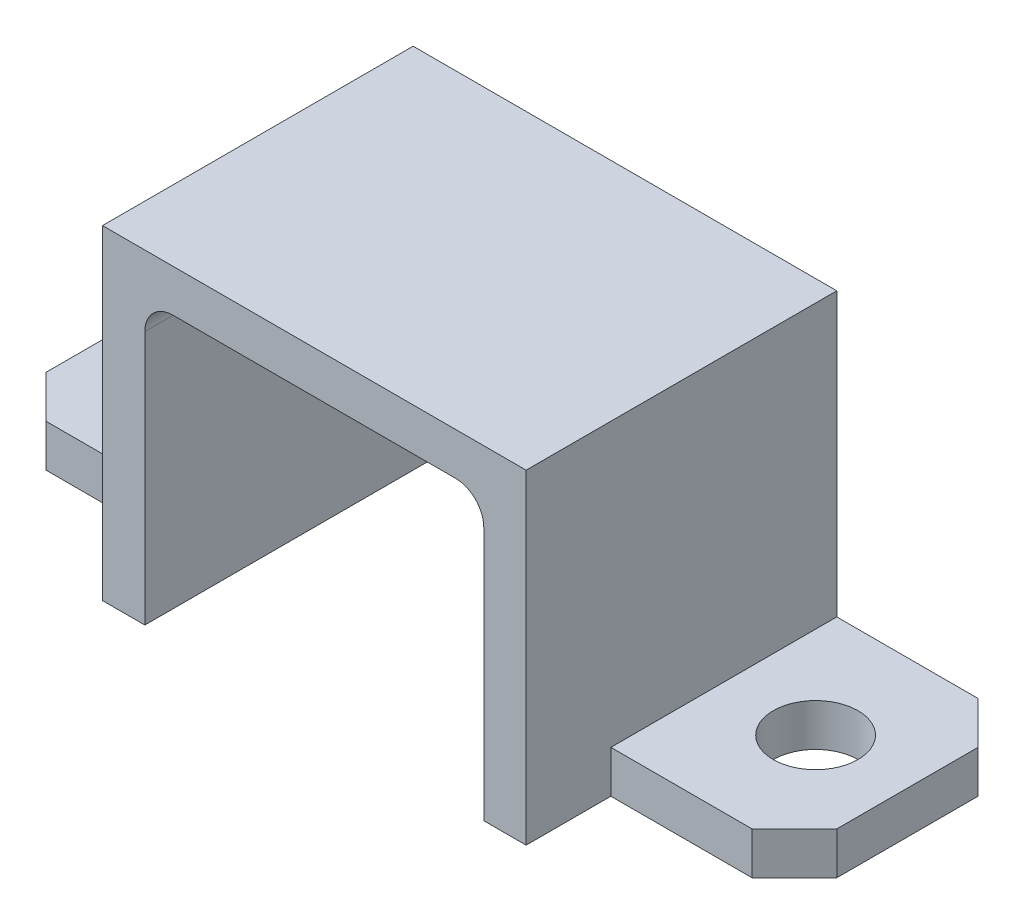
ISO-10303-21;
HEADER;
FILE_DESCRIPTION(('STEP AP214'),'2;1');
FILE_NAME('part.step','',(''),(''),'','','');
FILE_SCHEMA(('AUTOMOTIVE_DESIGN { 1 0 10303 214 1 1 1 1 }'));
ENDSEC;
DATA;
#1=APPLICATION_CONTEXT('core data for automotive mechanical design processes');
#2=APPLICATION_PROTOCOL_DEFINITION('international standard','automotive_design',2000,#1);
#3=PRODUCT_CONTEXT('',#1,'mechanical');
#4=PRODUCT('Part','Part','',(#3));
#5=PRODUCT_RELATED_PRODUCT_CATEGORY('part','',(#4));
#6=PRODUCT_DEFINITION_FORMATION('','',#4);
#7=PRODUCT_DEFINITION_CONTEXT('part definition',#1,'design');
#8=PRODUCT_DEFINITION('design','',#6,#7);
#9=PRODUCT_DEFINITION_SHAPE('','',#8);
#10=(LENGTH_UNIT() NAMED_UNIT(*) SI_UNIT(.MILLI.,.METRE.));
#11=(NAMED_UNIT(*) PLANE_ANGLE_UNIT() SI_UNIT($,.RADIAN.));
#12=(NAMED_UNIT(*) SI_UNIT($,.STERADIAN.) SOLID_ANGLE_UNIT());
#13=UNCERTAINTY_MEASURE_WITH_UNIT(LENGTH_MEASURE(1.E-05),#10,'distance_accuracy_value','');
#14=(GEOMETRIC_REPRESENTATION_CONTEXT(3) GLOBAL_UNCERTAINTY_ASSIGNED_CONTEXT((#13)) GLOBAL_UNIT_ASSIGNED_CONTEXT((#10,
#11,#12)) REPRESENTATION_CONTEXT('',''));
#15=CARTESIAN_POINT('',(0.,0.,0.));
#16=DIRECTION('',(0.,0.,1.));
#17=DIRECTION('',(1.,0.,0.));
#18=AXIS2_PLACEMENT_3D('',#15,#16,#17);
#19=CARTESIAN_POINT('',(22.,0.,11.));
#20=DIRECTION('',(-1.,0.,0.));
#21=DIRECTION('',(0.,0.,1.));
#22=AXIS2_PLACEMENT_3D('',#19,#20,#21);
#23=PLANE('',#22);
#24=DIRECTION('',(0.,0.,-1.));
#25=VECTOR('',#24,1.);
#26=CARTESIAN_POINT('',(22.,0.,11.));
#27=LINE('',#26,#25);
#28=CARTESIAN_POINT('',(22.,0.,6.5));
#29=VERTEX_POINT('',#28);
#30=CARTESIAN_POINT('',(22.,0.,1.5));
#31=VERTEX_POINT('',#30);
#32=EDGE_CURVE('E220',#29,#31,#27,.T.);
#33=ORIENTED_EDGE('',*,*,#32,.T.);
#34=DIRECTION('',(0.,1.,0.));
#35=VECTOR('',#34,1.);
#36=CARTESIAN_POINT('',(22.,0.,1.5));
#37=LINE('',#36,#35);
#38=CARTESIAN_POINT('',(22.,1.5,1.5));
#39=VERTEX_POINT('',#38);
#40=EDGE_CURVE('E359',#31,#39,#37,.T.);
#41=ORIENTED_EDGE('',*,*,#40,.T.);
#42=DIRECTION('',(0.,0.,-1.));
#43=VECTOR('',#42,1.);
#44=CARTESIAN_POINT('',(22.,1.5,11.));
#45=LINE('',#44,#43);
#46=CARTESIAN_POINT('',(22.,1.5,6.5));
#47=VERTEX_POINT('',#46);
#48=EDGE_CURVE('E217',#47,#39,#45,.T.);
#49=ORIENTED_EDGE('',*,*,#48,.F.);
#50=DIRECTION('',(0.,1.,0.));
#51=VECTOR('',#50,1.);
#52=CARTESIAN_POINT('',(22.,0.,6.5));
#53=LINE('',#52,#51);
#54=EDGE_CURVE('E349',#29,#47,#53,.T.);
#55=ORIENTED_EDGE('',*,*,#54,.F.);
#56=EDGE_LOOP('',(#33,#41,#49,#55));
#57=FACE_BOUND('',#56,.T.);
#58=ADVANCED_FACE('F36',(#57),#23,.F.);
#59=CARTESIAN_POINT('',(22.,1.5,11.));
#60=DIRECTION('',(0.,-1.,0.));
#61=DIRECTION('',(1.,0.,0.));
#62=AXIS2_PLACEMENT_3D('',#59,#60,#61);
#63=PLANE('',#62);
#64=CARTESIAN_POINT('',(18.75,1.5,4.));
#65=DIRECTION('',(0.,1.,0.));
#66=DIRECTION('',(1.,0.,0.));
#67=AXIS2_PLACEMENT_3D('',#64,#65,#66);
#68=CIRCLE('',#67,1.5);
#69=CARTESIAN_POINT('',(20.25,1.5,4.));
#70=VERTEX_POINT('',#69);
#71=EDGE_CURVE('E369',#70,#70,#68,.T.);
#72=ORIENTED_EDGE('',*,*,#71,.F.);
#73=EDGE_LOOP('',(#72));
#74=FACE_BOUND('',#73,.T.);
#75=ORIENTED_EDGE('',*,*,#48,.T.);
#76=DIRECTION('',(0.707106781186547,0.,0.707106781186548));
#77=VECTOR('',#76,1.);
#78=CARTESIAN_POINT('',(22.,1.5,1.5));
#79=LINE('',#78,#77);
#80=CARTESIAN_POINT('',(20.5,1.5,0.));
#81=VERTEX_POINT('',#80);
#82=EDGE_CURVE('E354',#81,#39,#79,.T.);
#83=ORIENTED_EDGE('',*,*,#82,.F.);
#84=DIRECTION('',(-1.,0.,0.));
#85=VECTOR('',#84,1.);
#86=CARTESIAN_POINT('',(22.,1.5,0.));
#87=LINE('',#86,#85);
#88=CARTESIAN_POINT('',(15.5,1.5,0.));
#89=VERTEX_POINT('',#88);
#90=EDGE_CURVE('E240',#81,#89,#87,.T.);
#91=ORIENTED_EDGE('',*,*,#90,.T.);
#92=DIRECTION('',(0.,0.,-1.));
#93=VECTOR('',#92,1.);
#94=CARTESIAN_POINT('',(15.5,1.5,11.));
#95=LINE('',#94,#93);
#96=CARTESIAN_POINT('',(15.5,1.5,8.));
#97=VERTEX_POINT('',#96);
#98=EDGE_CURVE('E214',#97,#89,#95,.T.);
#99=ORIENTED_EDGE('',*,*,#98,.F.);
#100=DIRECTION('',(-1.,0.,0.));
#101=VECTOR('',#100,1.);
#102=CARTESIAN_POINT('',(15.5,1.5,8.));
#103=LINE('',#102,#101);
#104=CARTESIAN_POINT('',(20.5,1.5,8.));
#105=VERTEX_POINT('',#104);
#106=EDGE_CURVE('E331',#105,#97,#103,.T.);
#107=ORIENTED_EDGE('',*,*,#106,.F.);
#108=DIRECTION('',(-0.707106781186547,0.,0.707106781186548));
#109=VECTOR('',#108,1.);
#110=CARTESIAN_POINT('',(22.,1.5,6.5));
#111=LINE('',#110,#109);
#112=EDGE_CURVE('E355',#47,#105,#111,.T.);
#113=ORIENTED_EDGE('',*,*,#112,.F.);
#114=EDGE_LOOP('',(#75,#83,#91,#99,#107,#113));
#115=FACE_BOUND('',#114,.T.);
#116=ADVANCED_FACE('F393',(#74,#115),#63,.F.);
#117=CARTESIAN_POINT('',(13.,9.,11.));
#118=DIRECTION('',(0.,0.,-1.));
#119=DIRECTION('',(-1.,0.,0.));
#120=AXIS2_PLACEMENT_3D('',#117,#118,#119);
#121=CYLINDRICAL_SURFACE('',#120,1.);
#122=CARTESIAN_POINT('',(13.,9.,0.));
#123=DIRECTION('',(0.,0.,-1.));
#124=DIRECTION('',(-1.,0.,0.));
#125=AXIS2_PLACEMENT_3D('',#122,#123,#124);
#126=CIRCLE('',#125,1.);
#127=CARTESIAN_POINT('',(13.,10.,0.));
#128=VERTEX_POINT('',#127);
#129=CARTESIAN_POINT('',(14.,9.,0.));
#130=VERTEX_POINT('',#129);
#131=EDGE_CURVE('E244',#128,#130,#126,.T.);
#132=ORIENTED_EDGE('',*,*,#131,.T.);
#133=DIRECTION('',(0.,0.,-1.));
#134=VECTOR('',#133,1.);
#135=CARTESIAN_POINT('',(14.,9.,11.));
#136=LINE('',#135,#134);
#137=CARTESIAN_POINT('',(14.,9.,11.));
#138=VERTEX_POINT('',#137);
#139=EDGE_CURVE('E11',#138,#130,#136,.T.);
#140=ORIENTED_EDGE('',*,*,#139,.F.);
#141=CARTESIAN_POINT('',(13.,9.,11.));
#142=DIRECTION('',(0.,0.,-1.));
#143=DIRECTION('',(-1.,0.,0.));
#144=AXIS2_PLACEMENT_3D('',#141,#142,#143);
#145=CIRCLE('',#144,1.);
#146=CARTESIAN_POINT('',(13.,10.,11.));
#147=VERTEX_POINT('',#146);
#148=EDGE_CURVE('E265',#147,#138,#145,.T.);
#149=ORIENTED_EDGE('',*,*,#148,.F.);
#150=DIRECTION('',(0.,0.,-1.));
#151=VECTOR('',#150,1.);
#152=CARTESIAN_POINT('',(13.,10.,11.));
#153=LINE('',#152,#151);
#154=EDGE_CURVE('E266',#147,#128,#153,.T.);
#155=ORIENTED_EDGE('',*,*,#154,.T.);
#156=EDGE_LOOP('',(#132,#140,#149,#155));
#157=FACE_BOUND('',#156,.T.);
#158=ADVANCED_FACE('F38',(#157),#121,.F.);
#159=CARTESIAN_POINT('',(14.,9.,11.));
#160=DIRECTION('',(1.,0.,0.));
#161=DIRECTION('',(0.,0.,-1.));
#162=AXIS2_PLACEMENT_3D('',#159,#160,#161);
#163=PLANE('',#162);
#164=DIRECTION('',(0.,-1.,0.));
#165=VECTOR('',#164,1.);
#166=CARTESIAN_POINT('',(14.,9.,0.));
#167=LINE('',#166,#165);
#168=CARTESIAN_POINT('',(14.,0.,0.));
#169=VERTEX_POINT('',#168);
#170=EDGE_CURVE('E237',#130,#169,#167,.T.);
#171=ORIENTED_EDGE('',*,*,#170,.T.);
#172=DIRECTION('',(0.,0.,-1.));
#173=VECTOR('',#172,1.);
#174=CARTESIAN_POINT('',(14.,0.,11.));
#175=LINE('',#174,#173);
#176=CARTESIAN_POINT('',(14.,0.,11.));
#177=VERTEX_POINT('',#176);
#178=EDGE_CURVE('E44',#177,#169,#175,.T.);
#179=ORIENTED_EDGE('',*,*,#178,.F.);
#180=DIRECTION('',(0.,-1.,0.));
#181=VECTOR('',#180,1.);
#182=CARTESIAN_POINT('',(14.,9.,11.));
#183=LINE('',#182,#181);
#184=EDGE_CURVE('E295',#138,#177,#183,.T.);
#185=ORIENTED_EDGE('',*,*,#184,.F.);
#186=ORIENTED_EDGE('',*,*,#139,.T.);
#187=EDGE_LOOP('',(#171,#179,#185,#186));
#188=FACE_BOUND('',#187,.T.);
#189=ADVANCED_FACE('F405',(#188),#163,.F.);
#190=CARTESIAN_POINT('',(14.,0.,11.));
#191=DIRECTION('',(0.,1.,0.));
#192=DIRECTION('',(-1.,0.,0.));
#193=AXIS2_PLACEMENT_3D('',#190,#191,#192);
#194=PLANE('',#193);
#195=CARTESIAN_POINT('',(18.75,0.,4.));
#196=DIRECTION('',(0.,1.,0.));
#197=DIRECTION('',(1.,0.,0.));
#198=AXIS2_PLACEMENT_3D('',#195,#196,#197);
#199=CIRCLE('',#198,1.5);
#200=CARTESIAN_POINT('',(20.25,0.,4.));
#201=VERTEX_POINT('',#200);
#202=EDGE_CURVE('E346',#201,#201,#199,.T.);
#203=ORIENTED_EDGE('',*,*,#202,.T.);
#204=EDGE_LOOP('',(#203));
#205=FACE_BOUND('',#204,.T.);
#206=DIRECTION('',(1.,0.,0.));
#207=VECTOR('',#206,1.);
#208=CARTESIAN_POINT('',(14.,0.,0.));
#209=LINE('',#208,#207);
#210=CARTESIAN_POINT('',(20.5,0.,0.));
#211=VERTEX_POINT('',#210);
#212=EDGE_CURVE('E229',#169,#211,#209,.T.);
#213=ORIENTED_EDGE('',*,*,#212,.T.);
#214=DIRECTION('',(0.707106781186547,0.,0.707106781186548));
#215=VECTOR('',#214,1.);
#216=CARTESIAN_POINT('',(22.,0.,1.5));
#217=LINE('',#216,#215);
#218=EDGE_CURVE('E51',#211,#31,#217,.T.);
#219=ORIENTED_EDGE('',*,*,#218,.T.);
#220=ORIENTED_EDGE('',*,*,#32,.F.);
#221=DIRECTION('',(-0.707106781186547,0.,0.707106781186548));
#222=VECTOR('',#221,1.);
#223=CARTESIAN_POINT('',(22.,0.,6.5));
#224=LINE('',#223,#222);
#225=CARTESIAN_POINT('',(20.5,0.,8.));
#226=VERTEX_POINT('',#225);
#227=EDGE_CURVE('E352',#29,#226,#224,.T.);
#228=ORIENTED_EDGE('',*,*,#227,.T.);
#229=DIRECTION('',(1.,0.,0.));
#230=VECTOR('',#229,1.);
#231=CARTESIAN_POINT('',(15.5,0.,8.));
#232=LINE('',#231,#230);
#233=CARTESIAN_POINT('',(15.5,0.,8.));
#234=VERTEX_POINT('',#233);
#235=EDGE_CURVE('E328',#234,#226,#232,.T.);
#236=ORIENTED_EDGE('',*,*,#235,.F.);
#237=DIRECTION('',(0.,0.,1.));
#238=VECTOR('',#237,1.);
#239=CARTESIAN_POINT('',(15.5,0.,8.));
#240=LINE('',#239,#238);
#241=CARTESIAN_POINT('',(15.5,0.,11.));
#242=VERTEX_POINT('',#241);
#243=EDGE_CURVE('E299',#234,#242,#240,.T.);
#244=ORIENTED_EDGE('',*,*,#243,.T.);
#245=DIRECTION('',(1.,0.,0.));
#246=VECTOR('',#245,1.);
#247=CARTESIAN_POINT('',(14.,0.,11.));
#248=LINE('',#247,#246);
#249=EDGE_CURVE('E232',#177,#242,#248,.T.);
#250=ORIENTED_EDGE('',*,*,#249,.F.);
#251=ORIENTED_EDGE('',*,*,#178,.T.);
#252=EDGE_LOOP('',(#213,#219,#220,#228,#236,#244,#250,#251));
#253=FACE_BOUND('',#252,.T.);
#254=ADVANCED_FACE('F228',(#205,#253),#194,.F.);
#255=CARTESIAN_POINT('',(15.5,11.5,11.));
#256=DIRECTION('',(-1.,0.,0.));
#257=DIRECTION('',(0.,-1.,0.));
#258=AXIS2_PLACEMENT_3D('',#255,#256,#257);
#259=PLANE('',#258);
#260=DIRECTION('',(0.,1.,0.));
#261=VECTOR('',#260,1.);
#262=CARTESIAN_POINT('',(15.5,11.5,0.));
#263=LINE('',#262,#261);
#264=CARTESIAN_POINT('',(15.5,11.5,0.));
#265=VERTEX_POINT('',#264);
#266=EDGE_CURVE('E242',#89,#265,#263,.T.);
#267=ORIENTED_EDGE('',*,*,#266,.T.);
#268=DIRECTION('',(0.,0.,-1.));
#269=VECTOR('',#268,1.);
#270=CARTESIAN_POINT('',(15.5,11.5,11.));
#271=LINE('',#270,#269);
#272=CARTESIAN_POINT('',(15.5,11.5,11.));
#273=VERTEX_POINT('',#272);
#274=EDGE_CURVE('E211',#273,#265,#271,.T.);
#275=ORIENTED_EDGE('',*,*,#274,.F.);
#276=DIRECTION('',(0.,1.,0.));
#277=VECTOR('',#276,1.);
#278=CARTESIAN_POINT('',(15.5,11.5,11.));
#279=LINE('',#278,#277);
#280=EDGE_CURVE('E303',#242,#273,#279,.T.);
#281=ORIENTED_EDGE('',*,*,#280,.F.);
#282=ORIENTED_EDGE('',*,*,#243,.F.);
#283=DIRECTION('',(0.,-1.,0.));
#284=VECTOR('',#283,1.);
#285=CARTESIAN_POINT('',(15.5,1.5,8.));
#286=LINE('',#285,#284);
#287=EDGE_CURVE('E325',#97,#234,#286,.T.);
#288=ORIENTED_EDGE('',*,*,#287,.F.);
#289=ORIENTED_EDGE('',*,*,#98,.T.);
#290=EDGE_LOOP('',(#267,#275,#281,#282,#288,#289));
#291=FACE_BOUND('',#290,.T.);
#292=ADVANCED_FACE('F404',(#291),#259,.F.);
#293=CARTESIAN_POINT('',(0.5,11.5,11.));
#294=DIRECTION('',(0.,-1.,0.));
#295=DIRECTION('',(0.,0.,-1.));
#296=AXIS2_PLACEMENT_3D('',#293,#294,#295);
#297=PLANE('',#296);
#298=DIRECTION('',(-1.,0.,0.));
#299=VECTOR('',#298,1.);
#300=CARTESIAN_POINT('',(0.5,11.5,0.));
#301=LINE('',#300,#299);
#302=CARTESIAN_POINT('',(0.5,11.5,0.));
#303=VERTEX_POINT('',#302);
#304=EDGE_CURVE('E249',#265,#303,#301,.T.);
#305=ORIENTED_EDGE('',*,*,#304,.T.);
#306=DIRECTION('',(0.,0.,-1.));
#307=VECTOR('',#306,1.);
#308=CARTESIAN_POINT('',(0.5,11.5,11.));
#309=LINE('',#308,#307);
#310=CARTESIAN_POINT('',(0.5,11.5,11.));
#311=VERTEX_POINT('',#310);
#312=EDGE_CURVE('E208',#311,#303,#309,.T.);
#313=ORIENTED_EDGE('',*,*,#312,.F.);
#314=DIRECTION('',(-1.,0.,0.));
#315=VECTOR('',#314,1.);
#316=CARTESIAN_POINT('',(0.5,11.5,11.));
#317=LINE('',#316,#315);
#318=EDGE_CURVE('E305',#273,#311,#317,.T.);
#319=ORIENTED_EDGE('',*,*,#318,.F.);
#320=ORIENTED_EDGE('',*,*,#274,.T.);
#321=EDGE_LOOP('',(#305,#313,#319,#320));
#322=FACE_BOUND('',#321,.T.);
#323=ADVANCED_FACE('F419',(#322),#297,.F.);
#324=CARTESIAN_POINT('',(0.5,1.5,11.));
#325=DIRECTION('',(1.,0.,0.));
#326=DIRECTION('',(0.,0.,-1.));
#327=AXIS2_PLACEMENT_3D('',#324,#325,#326);
#328=PLANE('',#327);
#329=DIRECTION('',(0.,-1.,0.));
#330=VECTOR('',#329,1.);
#331=CARTESIAN_POINT('',(0.5,1.5,0.));
#332=LINE('',#331,#330);
#333=CARTESIAN_POINT('',(0.5,1.5,0.));
#334=VERTEX_POINT('',#333);
#335=EDGE_CURVE('E251',#303,#334,#332,.T.);
#336=ORIENTED_EDGE('',*,*,#335,.T.);
#337=DIRECTION('',(0.,0.,-1.));
#338=VECTOR('',#337,1.);
#339=CARTESIAN_POINT('',(0.5,1.5,11.));
#340=LINE('',#339,#338);
#341=CARTESIAN_POINT('',(0.5,1.5,8.));
#342=VERTEX_POINT('',#341);
#343=EDGE_CURVE('E200',#342,#334,#340,.T.);
#344=ORIENTED_EDGE('',*,*,#343,.F.);
#345=DIRECTION('',(0.,1.,0.));
#346=VECTOR('',#345,1.);
#347=CARTESIAN_POINT('',(0.5,1.5,8.));
#348=LINE('',#347,#346);
#349=CARTESIAN_POINT('',(0.5,0.,8.));
#350=VERTEX_POINT('',#349);
#351=EDGE_CURVE('E336',#350,#342,#348,.T.);
#352=ORIENTED_EDGE('',*,*,#351,.F.);
#353=DIRECTION('',(0.,0.,1.));
#354=VECTOR('',#353,1.);
#355=CARTESIAN_POINT('',(0.5,0.,8.));
#356=LINE('',#355,#354);
#357=CARTESIAN_POINT('',(0.5,0.,11.));
#358=VERTEX_POINT('',#357);
#359=EDGE_CURVE('E314',#350,#358,#356,.T.);
#360=ORIENTED_EDGE('',*,*,#359,.T.);
#361=DIRECTION('',(0.,-1.,0.));
#362=VECTOR('',#361,1.);
#363=CARTESIAN_POINT('',(0.5,1.5,11.));
#364=LINE('',#363,#362);
#365=EDGE_CURVE('E307',#311,#358,#364,.T.);
#366=ORIENTED_EDGE('',*,*,#365,.F.);
#367=ORIENTED_EDGE('',*,*,#312,.T.);
#368=EDGE_LOOP('',(#336,#344,#352,#360,#366,#367));
#369=FACE_BOUND('',#368,.T.);
#370=ADVANCED_FACE('F421',(#369),#328,.F.);
#371=CARTESIAN_POINT('',(-6.,1.5,11.));
#372=DIRECTION('',(0.,-1.,0.));
#373=DIRECTION('',(1.,0.,0.));
#374=AXIS2_PLACEMENT_3D('',#371,#372,#373);
#375=PLANE('',#374);
#376=CARTESIAN_POINT('',(-2.75,1.5,4.));
#377=DIRECTION('',(0.,1.,0.));
#378=DIRECTION('',(-1.,0.,0.));
#379=AXIS2_PLACEMENT_3D('',#376,#377,#378);
#380=CIRCLE('',#379,1.5);
#381=CARTESIAN_POINT('',(-4.25,1.5,4.));
#382=VERTEX_POINT('',#381);
#383=EDGE_CURVE('E343',#382,#382,#380,.T.);
#384=ORIENTED_EDGE('',*,*,#383,.F.);
#385=EDGE_LOOP('',(#384));
#386=FACE_BOUND('',#385,.T.);
#387=DIRECTION('',(-1.,0.,0.));
#388=VECTOR('',#387,1.);
#389=CARTESIAN_POINT('',(-6.,1.5,0.));
#390=LINE('',#389,#388);
#391=CARTESIAN_POINT('',(-4.5,1.5,0.));
#392=VERTEX_POINT('',#391);
#393=EDGE_CURVE('E254',#334,#392,#390,.T.);
#394=ORIENTED_EDGE('',*,*,#393,.T.);
#395=DIRECTION('',(0.707106781186547,0.,-0.707106781186548));
#396=VECTOR('',#395,1.);
#397=CARTESIAN_POINT('',(-6.,1.5,1.5));
#398=LINE('',#397,#396);
#399=CARTESIAN_POINT('',(-6.,1.5,1.5));
#400=VERTEX_POINT('',#399);
#401=EDGE_CURVE('E59',#400,#392,#398,.T.);
#402=ORIENTED_EDGE('',*,*,#401,.F.);
#403=DIRECTION('',(0.,0.,-1.));
#404=VECTOR('',#403,1.);
#405=CARTESIAN_POINT('',(-6.,1.5,11.));
#406=LINE('',#405,#404);
#407=CARTESIAN_POINT('',(-6.,1.5,6.5));
#408=VERTEX_POINT('',#407);
#409=EDGE_CURVE('E197',#408,#400,#406,.T.);
#410=ORIENTED_EDGE('',*,*,#409,.F.);
#411=DIRECTION('',(-0.707106781186548,0.,-0.707106781186548));
#412=VECTOR('',#411,1.);
#413=CARTESIAN_POINT('',(-6.,1.5,6.5));
#414=LINE('',#413,#412);
#415=CARTESIAN_POINT('',(-4.5,1.5,8.));
#416=VERTEX_POINT('',#415);
#417=EDGE_CURVE('E178',#416,#408,#414,.T.);
#418=ORIENTED_EDGE('',*,*,#417,.F.);
#419=DIRECTION('',(-1.,0.,0.));
#420=VECTOR('',#419,1.);
#421=CARTESIAN_POINT('',(0.5,1.5,8.));
#422=LINE('',#421,#420);
#423=EDGE_CURVE('E321',#342,#416,#422,.T.);
#424=ORIENTED_EDGE('',*,*,#423,.F.);
#425=ORIENTED_EDGE('',*,*,#343,.T.);
#426=EDGE_LOOP('',(#394,#402,#410,#418,#424,#425));
#427=FACE_BOUND('',#426,.T.);
#428=ADVANCED_FACE('F378',(#386,#427),#375,.F.);
#429=CARTESIAN_POINT('',(-6.,0.,11.));
#430=DIRECTION('',(1.,0.,0.));
#431=DIRECTION('',(0.,0.,-1.));
#432=AXIS2_PLACEMENT_3D('',#429,#430,#431);
#433=PLANE('',#432);
#434=ORIENTED_EDGE('',*,*,#409,.T.);
#435=DIRECTION('',(0.,1.,0.));
#436=VECTOR('',#435,1.);
#437=CARTESIAN_POINT('',(-6.,0.,1.5));
#438=LINE('',#437,#436);
#439=CARTESIAN_POINT('',(-6.,0.,1.5));
#440=VERTEX_POINT('',#439);
#441=EDGE_CURVE('E196',#440,#400,#438,.T.);
#442=ORIENTED_EDGE('',*,*,#441,.F.);
#443=DIRECTION('',(0.,0.,-1.));
#444=VECTOR('',#443,1.);
#445=CARTESIAN_POINT('',(-6.,0.,11.));
#446=LINE('',#445,#444);
#447=CARTESIAN_POINT('',(-6.,0.,6.5));
#448=VERTEX_POINT('',#447);
#449=EDGE_CURVE('E190',#448,#440,#446,.T.);
#450=ORIENTED_EDGE('',*,*,#449,.F.);
#451=DIRECTION('',(0.,1.,0.));
#452=VECTOR('',#451,1.);
#453=CARTESIAN_POINT('',(-6.,0.,6.5));
#454=LINE('',#453,#452);
#455=EDGE_CURVE('E172',#448,#408,#454,.T.);
#456=ORIENTED_EDGE('',*,*,#455,.T.);
#457=EDGE_LOOP('',(#434,#442,#450,#456));
#458=FACE_BOUND('',#457,.T.);
#459=ADVANCED_FACE('F195',(#458),#433,.F.);
#460=CARTESIAN_POINT('',(2.,0.,11.));
#461=DIRECTION('',(0.,1.,0.));
#462=DIRECTION('',(-1.,0.,0.));
#463=AXIS2_PLACEMENT_3D('',#460,#461,#462);
#464=PLANE('',#463);
#465=CARTESIAN_POINT('',(-2.75,0.,4.));
#466=DIRECTION('',(0.,1.,0.));
#467=DIRECTION('',(-1.,0.,0.));
#468=AXIS2_PLACEMENT_3D('',#465,#466,#467);
#469=CIRCLE('',#468,1.5);
#470=CARTESIAN_POINT('',(-4.25,0.,4.));
#471=VERTEX_POINT('',#470);
#472=EDGE_CURVE('E329',#471,#471,#469,.T.);
#473=ORIENTED_EDGE('',*,*,#472,.T.);
#474=EDGE_LOOP('',(#473));
#475=FACE_BOUND('',#474,.T.);
#476=ORIENTED_EDGE('',*,*,#449,.T.);
#477=DIRECTION('',(0.707106781186547,0.,-0.707106781186548));
#478=VECTOR('',#477,1.);
#479=CARTESIAN_POINT('',(-6.,0.,1.5));
#480=LINE('',#479,#478);
#481=CARTESIAN_POINT('',(-4.5,0.,0.));
#482=VERTEX_POINT('',#481);
#483=EDGE_CURVE('E367',#440,#482,#480,.T.);
#484=ORIENTED_EDGE('',*,*,#483,.T.);
#485=DIRECTION('',(1.,0.,0.));
#486=VECTOR('',#485,1.);
#487=CARTESIAN_POINT('',(2.,0.,0.));
#488=LINE('',#487,#486);
#489=CARTESIAN_POINT('',(2.,0.,0.));
#490=VERTEX_POINT('',#489);
#491=EDGE_CURVE('E257',#482,#490,#488,.T.);
#492=ORIENTED_EDGE('',*,*,#491,.T.);
#493=DIRECTION('',(0.,0.,-1.));
#494=VECTOR('',#493,1.);
#495=CARTESIAN_POINT('',(2.,0.,11.));
#496=LINE('',#495,#494);
#497=CARTESIAN_POINT('',(2.,0.,11.));
#498=VERTEX_POINT('',#497);
#499=EDGE_CURVE('E198',#498,#490,#496,.T.);
#500=ORIENTED_EDGE('',*,*,#499,.F.);
#501=DIRECTION('',(1.,0.,0.));
#502=VECTOR('',#501,1.);
#503=CARTESIAN_POINT('',(2.,0.,11.));
#504=LINE('',#503,#502);
#505=EDGE_CURVE('E309',#358,#498,#504,.T.);
#506=ORIENTED_EDGE('',*,*,#505,.F.);
#507=ORIENTED_EDGE('',*,*,#359,.F.);
#508=DIRECTION('',(1.,0.,0.));
#509=VECTOR('',#508,1.);
#510=CARTESIAN_POINT('',(0.5,0.,8.));
#511=LINE('',#510,#509);
#512=CARTESIAN_POINT('',(-4.5,0.,8.));
#513=VERTEX_POINT('',#512);
#514=EDGE_CURVE('E192',#513,#350,#511,.T.);
#515=ORIENTED_EDGE('',*,*,#514,.F.);
#516=DIRECTION('',(-0.707106781186548,0.,-0.707106781186548));
#517=VECTOR('',#516,1.);
#518=CARTESIAN_POINT('',(-6.,0.,6.5));
#519=LINE('',#518,#517);
#520=EDGE_CURVE('E175',#513,#448,#519,.T.);
#521=ORIENTED_EDGE('',*,*,#520,.T.);
#522=EDGE_LOOP('',(#476,#484,#492,#500,#506,#507,#515,#521));
#523=FACE_BOUND('',#522,.T.);
#524=ADVANCED_FACE('F188',(#475,#523),#464,.F.);
#525=CARTESIAN_POINT('',(2.,0.,11.));
#526=DIRECTION('',(-1.,0.,0.));
#527=DIRECTION('',(0.,0.,1.));
#528=AXIS2_PLACEMENT_3D('',#525,#526,#527);
#529=PLANE('',#528);
#530=DIRECTION('',(0.,1.,0.));
#531=VECTOR('',#530,1.);
#532=CARTESIAN_POINT('',(2.,0.,0.));
#533=LINE('',#532,#531);
#534=CARTESIAN_POINT('',(2.,9.,0.));
#535=VERTEX_POINT('',#534);
#536=EDGE_CURVE('E259',#490,#535,#533,.T.);
#537=ORIENTED_EDGE('',*,*,#536,.T.);
#538=DIRECTION('',(0.,0.,-1.));
#539=VECTOR('',#538,1.);
#540=CARTESIAN_POINT('',(2.,9.,11.));
#541=LINE('',#540,#539);
#542=CARTESIAN_POINT('',(2.,9.,11.));
#543=VERTEX_POINT('',#542);
#544=EDGE_CURVE('E203',#543,#535,#541,.T.);
#545=ORIENTED_EDGE('',*,*,#544,.F.);
#546=DIRECTION('',(0.,1.,0.));
#547=VECTOR('',#546,1.);
#548=CARTESIAN_POINT('',(2.,0.,11.));
#549=LINE('',#548,#547);
#550=EDGE_CURVE('E311',#498,#543,#549,.T.);
#551=ORIENTED_EDGE('',*,*,#550,.F.);
#552=ORIENTED_EDGE('',*,*,#499,.T.);
#553=EDGE_LOOP('',(#537,#545,#551,#552));
#554=FACE_BOUND('',#553,.T.);
#555=ADVANCED_FACE('F423',(#554),#529,.F.);
#556=CARTESIAN_POINT('',(3.,9.,11.));
#557=DIRECTION('',(0.,0.,-1.));
#558=DIRECTION('',(-1.,0.,0.));
#559=AXIS2_PLACEMENT_3D('',#556,#557,#558);
#560=CYLINDRICAL_SURFACE('',#559,1.);
#561=CARTESIAN_POINT('',(3.,9.,0.));
#562=DIRECTION('',(0.,0.,-1.));
#563=DIRECTION('',(-1.,0.,0.));
#564=AXIS2_PLACEMENT_3D('',#561,#562,#563);
#565=CIRCLE('',#564,1.);
#566=CARTESIAN_POINT('',(3.,10.,0.));
#567=VERTEX_POINT('',#566);
#568=EDGE_CURVE('E261',#535,#567,#565,.T.);
#569=ORIENTED_EDGE('',*,*,#568,.T.);
#570=DIRECTION('',(0.,0.,-1.));
#571=VECTOR('',#570,1.);
#572=CARTESIAN_POINT('',(3.,10.,11.));
#573=LINE('',#572,#571);
#574=CARTESIAN_POINT('',(3.,10.,11.));
#575=VERTEX_POINT('',#574);
#576=EDGE_CURVE('E269',#575,#567,#573,.T.);
#577=ORIENTED_EDGE('',*,*,#576,.F.);
#578=CARTESIAN_POINT('',(3.,9.,11.));
#579=DIRECTION('',(0.,0.,-1.));
#580=DIRECTION('',(-1.,0.,0.));
#581=AXIS2_PLACEMENT_3D('',#578,#579,#580);
#582=CIRCLE('',#581,1.);
#583=EDGE_CURVE('E279',#543,#575,#582,.T.);
#584=ORIENTED_EDGE('',*,*,#583,.F.);
#585=ORIENTED_EDGE('',*,*,#544,.T.);
#586=EDGE_LOOP('',(#569,#577,#584,#585));
#587=FACE_BOUND('',#586,.T.);
#588=ADVANCED_FACE('F277',(#587),#560,.F.);
#589=CARTESIAN_POINT('',(3.,10.,11.));
#590=DIRECTION('',(0.,1.,0.));
#591=DIRECTION('',(0.,0.,1.));
#592=AXIS2_PLACEMENT_3D('',#589,#590,#591);
#593=PLANE('',#592);
#594=DIRECTION('',(1.,0.,0.));
#595=VECTOR('',#594,1.);
#596=CARTESIAN_POINT('',(3.,10.,0.));
#597=LINE('',#596,#595);
#598=EDGE_CURVE('E263',#567,#128,#597,.T.);
#599=ORIENTED_EDGE('',*,*,#598,.T.);
#600=ORIENTED_EDGE('',*,*,#154,.F.);
#601=DIRECTION('',(1.,0.,0.));
#602=VECTOR('',#601,1.);
#603=CARTESIAN_POINT('',(3.,10.,11.));
#604=LINE('',#603,#602);
#605=EDGE_CURVE('E270',#575,#147,#604,.T.);
#606=ORIENTED_EDGE('',*,*,#605,.F.);
#607=ORIENTED_EDGE('',*,*,#576,.T.);
#608=EDGE_LOOP('',(#599,#600,#606,#607));
#609=FACE_BOUND('',#608,.T.);
#610=ADVANCED_FACE('F288',(#609),#593,.F.);
#611=CARTESIAN_POINT('',(13.,9.,11.));
#612=DIRECTION('',(0.,0.,-1.));
#613=DIRECTION('',(-1.,0.,0.));
#614=AXIS2_PLACEMENT_3D('',#611,#612,#613);
#615=PLANE('',#614);
#616=ORIENTED_EDGE('',*,*,#365,.T.);
#617=ORIENTED_EDGE('',*,*,#505,.T.);
#618=ORIENTED_EDGE('',*,*,#550,.T.);
#619=ORIENTED_EDGE('',*,*,#583,.T.);
#620=ORIENTED_EDGE('',*,*,#605,.T.);
#621=ORIENTED_EDGE('',*,*,#148,.T.);
#622=ORIENTED_EDGE('',*,*,#184,.T.);
#623=ORIENTED_EDGE('',*,*,#249,.T.);
#624=ORIENTED_EDGE('',*,*,#280,.T.);
#625=ORIENTED_EDGE('',*,*,#318,.T.);
#626=EDGE_LOOP('',(#616,#617,#618,#619,#620,#621,#622,#623,#624,#625));
#627=FACE_BOUND('',#626,.T.);
#628=ADVANCED_FACE('F411',(#627),#615,.F.);
#629=CARTESIAN_POINT('',(13.,9.,0.));
#630=DIRECTION('',(0.,0.,-1.));
#631=DIRECTION('',(-1.,0.,0.));
#632=AXIS2_PLACEMENT_3D('',#629,#630,#631);
#633=PLANE('',#632);
#634=DIRECTION('',(0.,1.,0.));
#635=VECTOR('',#634,1.);
#636=CARTESIAN_POINT('',(-4.5,0.,0.));
#637=LINE('',#636,#635);
#638=EDGE_CURVE('E366',#482,#392,#637,.T.);
#639=ORIENTED_EDGE('',*,*,#638,.T.);
#640=ORIENTED_EDGE('',*,*,#393,.F.);
#641=ORIENTED_EDGE('',*,*,#335,.F.);
#642=ORIENTED_EDGE('',*,*,#304,.F.);
#643=ORIENTED_EDGE('',*,*,#266,.F.);
#644=ORIENTED_EDGE('',*,*,#90,.F.);
#645=DIRECTION('',(0.,1.,0.));
#646=VECTOR('',#645,1.);
#647=CARTESIAN_POINT('',(20.5,0.,0.));
#648=LINE('',#647,#646);
#649=EDGE_CURVE('E239',#211,#81,#648,.T.);
#650=ORIENTED_EDGE('',*,*,#649,.F.);
#651=ORIENTED_EDGE('',*,*,#212,.F.);
#652=ORIENTED_EDGE('',*,*,#170,.F.);
#653=ORIENTED_EDGE('',*,*,#131,.F.);
#654=ORIENTED_EDGE('',*,*,#598,.F.);
#655=ORIENTED_EDGE('',*,*,#568,.F.);
#656=ORIENTED_EDGE('',*,*,#536,.F.);
#657=ORIENTED_EDGE('',*,*,#491,.F.);
#658=EDGE_LOOP('',(#639,#640,#641,#642,#643,#644,#650,#651,#652,#653,#654,#655,#656,#657));
#659=FACE_BOUND('',#658,.T.);
#660=ADVANCED_FACE('F235',(#659),#633,.T.);
#661=CARTESIAN_POINT('',(0.,0.,8.));
#662=DIRECTION('',(0.,0.,1.));
#663=DIRECTION('',(1.,0.,0.));
#664=AXIS2_PLACEMENT_3D('',#661,#662,#663);
#665=PLANE('',#664);
#666=DIRECTION('',(0.,1.,0.));
#667=VECTOR('',#666,1.);
#668=CARTESIAN_POINT('',(20.5,0.,8.));
#669=LINE('',#668,#667);
#670=EDGE_CURVE('E351',#226,#105,#669,.T.);
#671=ORIENTED_EDGE('',*,*,#670,.T.);
#672=ORIENTED_EDGE('',*,*,#106,.T.);
#673=ORIENTED_EDGE('',*,*,#287,.T.);
#674=ORIENTED_EDGE('',*,*,#235,.T.);
#675=EDGE_LOOP('',(#671,#672,#673,#674));
#676=FACE_BOUND('',#675,.T.);
#677=ADVANCED_FACE('F382',(#676),#665,.T.);
#678=CARTESIAN_POINT('',(0.,0.,8.));
#679=DIRECTION('',(0.,0.,-1.));
#680=DIRECTION('',(-1.,0.,0.));
#681=AXIS2_PLACEMENT_3D('',#678,#679,#680);
#682=PLANE('',#681);
#683=ORIENTED_EDGE('',*,*,#423,.T.);
#684=DIRECTION('',(0.,1.,0.));
#685=VECTOR('',#684,1.);
#686=CARTESIAN_POINT('',(-4.5,0.,8.));
#687=LINE('',#686,#685);
#688=EDGE_CURVE('E183',#513,#416,#687,.T.);
#689=ORIENTED_EDGE('',*,*,#688,.F.);
#690=ORIENTED_EDGE('',*,*,#514,.T.);
#691=ORIENTED_EDGE('',*,*,#351,.T.);
#692=EDGE_LOOP('',(#683,#689,#690,#691));
#693=FACE_BOUND('',#692,.T.);
#694=ADVANCED_FACE('F380',(#693),#682,.F.);
#695=CARTESIAN_POINT('',(-6.,0.,6.5));
#696=DIRECTION('',(0.707106781186548,0.,-0.707106781186548));
#697=DIRECTION('',(-0.707106781186548,0.,-0.707106781186548));
#698=AXIS2_PLACEMENT_3D('',#695,#696,#697);
#699=PLANE('',#698);
#700=ORIENTED_EDGE('',*,*,#417,.T.);
#701=ORIENTED_EDGE('',*,*,#455,.F.);
#702=ORIENTED_EDGE('',*,*,#520,.F.);
#703=ORIENTED_EDGE('',*,*,#688,.T.);
#704=EDGE_LOOP('',(#700,#701,#702,#703));
#705=FACE_BOUND('',#704,.T.);
#706=ADVANCED_FACE('F174',(#705),#699,.F.);
#707=CARTESIAN_POINT('',(22.,0.,6.5));
#708=DIRECTION('',(-0.707106781186548,0.,-0.707106781186547));
#709=DIRECTION('',(-0.707106781186547,0.,0.707106781186548));
#710=AXIS2_PLACEMENT_3D('',#707,#708,#709);
#711=PLANE('',#710);
#712=ORIENTED_EDGE('',*,*,#112,.T.);
#713=ORIENTED_EDGE('',*,*,#670,.F.);
#714=ORIENTED_EDGE('',*,*,#227,.F.);
#715=ORIENTED_EDGE('',*,*,#54,.T.);
#716=EDGE_LOOP('',(#712,#713,#714,#715));
#717=FACE_BOUND('',#716,.T.);
#718=ADVANCED_FACE('F388',(#717),#711,.F.);
#719=CARTESIAN_POINT('',(22.,0.,1.5));
#720=DIRECTION('',(-0.707106781186548,0.,0.707106781186547));
#721=DIRECTION('',(0.707106781186547,0.,0.707106781186548));
#722=AXIS2_PLACEMENT_3D('',#719,#720,#721);
#723=PLANE('',#722);
#724=ORIENTED_EDGE('',*,*,#82,.T.);
#725=ORIENTED_EDGE('',*,*,#40,.F.);
#726=ORIENTED_EDGE('',*,*,#218,.F.);
#727=ORIENTED_EDGE('',*,*,#649,.T.);
#728=EDGE_LOOP('',(#724,#725,#726,#727));
#729=FACE_BOUND('',#728,.T.);
#730=ADVANCED_FACE('F507',(#729),#723,.F.);
#731=CARTESIAN_POINT('',(-6.,0.,1.5));
#732=DIRECTION('',(0.707106781186548,0.,0.707106781186547));
#733=DIRECTION('',(0.707106781186547,0.,-0.707106781186548));
#734=AXIS2_PLACEMENT_3D('',#731,#732,#733);
#735=PLANE('',#734);
#736=ORIENTED_EDGE('',*,*,#401,.T.);
#737=ORIENTED_EDGE('',*,*,#638,.F.);
#738=ORIENTED_EDGE('',*,*,#483,.F.);
#739=ORIENTED_EDGE('',*,*,#441,.T.);
#740=EDGE_LOOP('',(#736,#737,#738,#739));
#741=FACE_BOUND('',#740,.T.);
#742=ADVANCED_FACE('F517',(#741),#735,.F.);
#743=CARTESIAN_POINT('',(-2.75,0.,4.));
#744=DIRECTION('',(0.,1.,0.));
#745=DIRECTION('',(-1.,0.,0.));
#746=AXIS2_PLACEMENT_3D('',#743,#744,#745);
#747=CYLINDRICAL_SURFACE('',#746,1.5);
#748=ORIENTED_EDGE('',*,*,#472,.F.);
#749=EDGE_LOOP('',(#748));
#750=FACE_BOUND('',#749,.T.);
#751=ORIENTED_EDGE('',*,*,#383,.T.);
#752=EDGE_LOOP('',(#751));
#753=FACE_BOUND('',#752,.T.);
#754=ADVANCED_FACE('F526',(#750,#753),#747,.F.);
#755=CARTESIAN_POINT('',(18.75,0.,4.));
#756=DIRECTION('',(0.,1.,0.));
#757=DIRECTION('',(-1.,0.,0.));
#758=AXIS2_PLACEMENT_3D('',#755,#756,#757);
#759=CYLINDRICAL_SURFACE('',#758,1.5);
#760=ORIENTED_EDGE('',*,*,#202,.F.);
#761=EDGE_LOOP('',(#760));
#762=FACE_BOUND('',#761,.T.);
#763=ORIENTED_EDGE('',*,*,#71,.T.);
#764=EDGE_LOOP('',(#763));
#765=FACE_BOUND('',#764,.T.);
#766=ADVANCED_FACE('F535',(#762,#765),#759,.F.);
#767=CLOSED_SHELL('',(#58,#116,#158,#189,#254,#292,#323,#370,#428,#459,#524,#555,#588,#610,#628,
#660,#677,#694,#706,#718,#730,#742,#754,#766));
#768=MANIFOLD_SOLID_BREP('B2',#767);
#769=ADVANCED_BREP_SHAPE_REPRESENTATION('',(#18,#768),#14);
#770=SHAPE_DEFINITION_REPRESENTATION(#9,#769);
ENDSEC;
END-ISO-10303-21;
